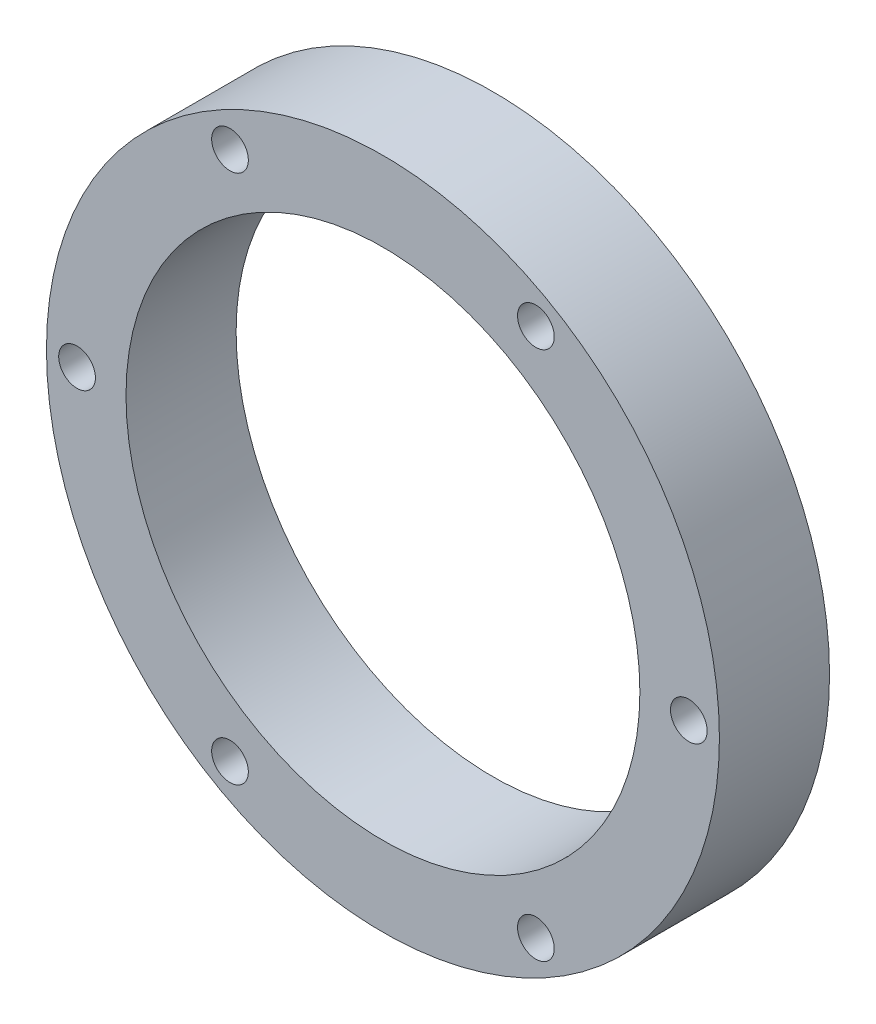
ISO-10303-21;
HEADER;
FILE_DESCRIPTION(('STEP AP214'),'2;1');
FILE_NAME('part.step','',(''),(''),'','','');
FILE_SCHEMA(('AUTOMOTIVE_DESIGN { 1 0 10303 214 1 1 1 1 }'));
ENDSEC;
DATA;
#1=APPLICATION_CONTEXT('core data for automotive mechanical design processes');
#2=APPLICATION_PROTOCOL_DEFINITION('international standard','automotive_design',2000,#1);
#3=PRODUCT_CONTEXT('',#1,'mechanical');
#4=PRODUCT('Part','Part','',(#3));
#5=PRODUCT_RELATED_PRODUCT_CATEGORY('part','',(#4));
#6=PRODUCT_DEFINITION_FORMATION('','',#4);
#7=PRODUCT_DEFINITION_CONTEXT('part definition',#1,'design');
#8=PRODUCT_DEFINITION('design','',#6,#7);
#9=PRODUCT_DEFINITION_SHAPE('','',#8);
#10=(LENGTH_UNIT() NAMED_UNIT(*) SI_UNIT(.MILLI.,.METRE.));
#11=(NAMED_UNIT(*) PLANE_ANGLE_UNIT() SI_UNIT($,.RADIAN.));
#12=(NAMED_UNIT(*) SI_UNIT($,.STERADIAN.) SOLID_ANGLE_UNIT());
#13=UNCERTAINTY_MEASURE_WITH_UNIT(LENGTH_MEASURE(1.E-05),#10,'distance_accuracy_value','');
#14=(GEOMETRIC_REPRESENTATION_CONTEXT(3) GLOBAL_UNCERTAINTY_ASSIGNED_CONTEXT((#13)) GLOBAL_UNIT_ASSIGNED_CONTEXT((#10,
#11,#12)) REPRESENTATION_CONTEXT('',''));
#15=CARTESIAN_POINT('',(0.,0.,0.));
#16=DIRECTION('',(0.,0.,1.));
#17=DIRECTION('',(1.,0.,0.));
#18=AXIS2_PLACEMENT_3D('',#15,#16,#17);
#19=CARTESIAN_POINT('',(0.,0.,9.));
#20=DIRECTION('',(0.,0.,1.));
#21=DIRECTION('',(1.,0.,0.));
#22=AXIS2_PLACEMENT_3D('',#19,#20,#21);
#23=PLANE('',#22);
#24=CARTESIAN_POINT('',(25.,0.,9.));
#25=DIRECTION('',(0.,0.,1.));
#26=DIRECTION('',(1.,0.,0.));
#27=AXIS2_PLACEMENT_3D('',#24,#25,#26);
#28=CIRCLE('',#27,1.5);
#29=CARTESIAN_POINT('',(26.5,0.,9.));
#30=VERTEX_POINT('',#29);
#31=EDGE_CURVE('E72',#30,#30,#28,.T.);
#32=ORIENTED_EDGE('',*,*,#31,.F.);
#33=EDGE_LOOP('',(#32));
#34=FACE_BOUND('',#33,.T.);
#35=CARTESIAN_POINT('',(-12.4999999999999,-21.650635094611,9.));
#36=DIRECTION('',(0.,0.,1.));
#37=DIRECTION('',(1.,0.,0.));
#38=AXIS2_PLACEMENT_3D('',#35,#36,#37);
#39=CIRCLE('',#38,1.5);
#40=CARTESIAN_POINT('',(-10.9999999999999,-21.650635094611,9.));
#41=VERTEX_POINT('',#40);
#42=EDGE_CURVE('E60',#41,#41,#39,.T.);
#43=ORIENTED_EDGE('',*,*,#42,.F.);
#44=EDGE_LOOP('',(#43));
#45=FACE_BOUND('',#44,.T.);
#46=CARTESIAN_POINT('',(-12.5000000000001,21.6506350946109,9.));
#47=DIRECTION('',(0.,0.,1.));
#48=DIRECTION('',(1.,0.,0.));
#49=AXIS2_PLACEMENT_3D('',#46,#47,#48);
#50=CIRCLE('',#49,1.5);
#51=CARTESIAN_POINT('',(-11.0000000000001,21.6506350946109,9.));
#52=VERTEX_POINT('',#51);
#53=EDGE_CURVE('E48',#52,#52,#50,.T.);
#54=ORIENTED_EDGE('',*,*,#53,.F.);
#55=EDGE_LOOP('',(#54));
#56=FACE_BOUND('',#55,.T.);
#57=CARTESIAN_POINT('',(0.,0.,9.));
#58=DIRECTION('',(0.,0.,1.));
#59=DIRECTION('',(1.,0.,0.));
#60=AXIS2_PLACEMENT_3D('',#57,#58,#59);
#61=CIRCLE('',#60,27.5);
#62=CARTESIAN_POINT('',(27.5,0.,9.));
#63=VERTEX_POINT('',#62);
#64=EDGE_CURVE('E10',#63,#63,#61,.T.);
#65=ORIENTED_EDGE('',*,*,#64,.T.);
#66=EDGE_LOOP('',(#65));
#67=FACE_BOUND('',#66,.T.);
#68=CARTESIAN_POINT('',(0.,0.,9.));
#69=DIRECTION('',(0.,0.,1.));
#70=DIRECTION('',(1.,0.,0.));
#71=AXIS2_PLACEMENT_3D('',#68,#69,#70);
#72=CIRCLE('',#71,21.);
#73=CARTESIAN_POINT('',(21.,0.,9.));
#74=VERTEX_POINT('',#73);
#75=EDGE_CURVE('E43',#74,#74,#72,.T.);
#76=ORIENTED_EDGE('',*,*,#75,.F.);
#77=EDGE_LOOP('',(#76));
#78=FACE_BOUND('',#77,.T.);
#79=CARTESIAN_POINT('',(-25.,0.,9.));
#80=DIRECTION('',(0.,0.,1.));
#81=DIRECTION('',(1.,0.,0.));
#82=AXIS2_PLACEMENT_3D('',#79,#80,#81);
#83=CIRCLE('',#82,1.5);
#84=CARTESIAN_POINT('',(-23.5,0.,9.));
#85=VERTEX_POINT('',#84);
#86=EDGE_CURVE('E54',#85,#85,#83,.T.);
#87=ORIENTED_EDGE('',*,*,#86,.F.);
#88=EDGE_LOOP('',(#87));
#89=FACE_BOUND('',#88,.T.);
#90=CARTESIAN_POINT('',(12.5000000000001,-21.6506350946109,9.));
#91=DIRECTION('',(0.,0.,1.));
#92=DIRECTION('',(1.,0.,0.));
#93=AXIS2_PLACEMENT_3D('',#90,#91,#92);
#94=CIRCLE('',#93,1.5);
#95=CARTESIAN_POINT('',(14.0000000000001,-21.6506350946109,9.));
#96=VERTEX_POINT('',#95);
#97=EDGE_CURVE('E66',#96,#96,#94,.T.);
#98=ORIENTED_EDGE('',*,*,#97,.F.);
#99=EDGE_LOOP('',(#98));
#100=FACE_BOUND('',#99,.T.);
#101=CARTESIAN_POINT('',(12.4999999999999,21.650635094611,9.));
#102=DIRECTION('',(0.,0.,1.));
#103=DIRECTION('',(1.,0.,0.));
#104=AXIS2_PLACEMENT_3D('',#101,#102,#103);
#105=CIRCLE('',#104,1.5);
#106=CARTESIAN_POINT('',(13.9999999999999,21.650635094611,9.));
#107=VERTEX_POINT('',#106);
#108=EDGE_CURVE('E78',#107,#107,#105,.T.);
#109=ORIENTED_EDGE('',*,*,#108,.F.);
#110=EDGE_LOOP('',(#109));
#111=FACE_BOUND('',#110,.T.);
#112=ADVANCED_FACE('F32',(#34,#45,#56,#67,#78,#89,#100,#111),#23,.T.);
#113=CARTESIAN_POINT('',(0.,0.,0.));
#114=DIRECTION('',(0.,0.,1.));
#115=DIRECTION('',(1.,0.,0.));
#116=AXIS2_PLACEMENT_3D('',#113,#114,#115);
#117=PLANE('',#116);
#118=CARTESIAN_POINT('',(0.,0.,0.));
#119=DIRECTION('',(0.,0.,1.));
#120=DIRECTION('',(1.,0.,0.));
#121=AXIS2_PLACEMENT_3D('',#118,#119,#120);
#122=CIRCLE('',#121,27.5);
#123=CARTESIAN_POINT('',(27.5,0.,0.));
#124=VERTEX_POINT('',#123);
#125=EDGE_CURVE('E36',#124,#124,#122,.T.);
#126=ORIENTED_EDGE('',*,*,#125,.F.);
#127=EDGE_LOOP('',(#126));
#128=FACE_BOUND('',#127,.T.);
#129=CARTESIAN_POINT('',(0.,0.,0.));
#130=DIRECTION('',(0.,0.,1.));
#131=DIRECTION('',(1.,0.,0.));
#132=AXIS2_PLACEMENT_3D('',#129,#130,#131);
#133=CIRCLE('',#132,21.);
#134=CARTESIAN_POINT('',(21.,0.,0.));
#135=VERTEX_POINT('',#134);
#136=EDGE_CURVE('E45',#135,#135,#133,.T.);
#137=ORIENTED_EDGE('',*,*,#136,.T.);
#138=EDGE_LOOP('',(#137));
#139=FACE_BOUND('',#138,.T.);
#140=CARTESIAN_POINT('',(-12.5000000000001,21.6506350946109,0.));
#141=DIRECTION('',(0.,0.,1.));
#142=DIRECTION('',(1.,0.,0.));
#143=AXIS2_PLACEMENT_3D('',#140,#141,#142);
#144=CIRCLE('',#143,1.5);
#145=CARTESIAN_POINT('',(-11.0000000000001,21.6506350946109,0.));
#146=VERTEX_POINT('',#145);
#147=EDGE_CURVE('E51',#146,#146,#144,.T.);
#148=ORIENTED_EDGE('',*,*,#147,.T.);
#149=EDGE_LOOP('',(#148));
#150=FACE_BOUND('',#149,.T.);
#151=CARTESIAN_POINT('',(-25.,0.,0.));
#152=DIRECTION('',(0.,0.,1.));
#153=DIRECTION('',(1.,0.,0.));
#154=AXIS2_PLACEMENT_3D('',#151,#152,#153);
#155=CIRCLE('',#154,1.5);
#156=CARTESIAN_POINT('',(-23.5,0.,0.));
#157=VERTEX_POINT('',#156);
#158=EDGE_CURVE('E57',#157,#157,#155,.T.);
#159=ORIENTED_EDGE('',*,*,#158,.T.);
#160=EDGE_LOOP('',(#159));
#161=FACE_BOUND('',#160,.T.);
#162=CARTESIAN_POINT('',(-12.4999999999999,-21.650635094611,0.));
#163=DIRECTION('',(0.,0.,1.));
#164=DIRECTION('',(1.,0.,0.));
#165=AXIS2_PLACEMENT_3D('',#162,#163,#164);
#166=CIRCLE('',#165,1.5);
#167=CARTESIAN_POINT('',(-10.9999999999999,-21.650635094611,0.));
#168=VERTEX_POINT('',#167);
#169=EDGE_CURVE('E63',#168,#168,#166,.T.);
#170=ORIENTED_EDGE('',*,*,#169,.T.);
#171=EDGE_LOOP('',(#170));
#172=FACE_BOUND('',#171,.T.);
#173=CARTESIAN_POINT('',(12.5000000000001,-21.6506350946109,0.));
#174=DIRECTION('',(0.,0.,1.));
#175=DIRECTION('',(1.,0.,0.));
#176=AXIS2_PLACEMENT_3D('',#173,#174,#175);
#177=CIRCLE('',#176,1.5);
#178=CARTESIAN_POINT('',(14.0000000000001,-21.6506350946109,0.));
#179=VERTEX_POINT('',#178);
#180=EDGE_CURVE('E69',#179,#179,#177,.T.);
#181=ORIENTED_EDGE('',*,*,#180,.T.);
#182=EDGE_LOOP('',(#181));
#183=FACE_BOUND('',#182,.T.);
#184=CARTESIAN_POINT('',(25.,0.,0.));
#185=DIRECTION('',(0.,0.,1.));
#186=DIRECTION('',(1.,0.,0.));
#187=AXIS2_PLACEMENT_3D('',#184,#185,#186);
#188=CIRCLE('',#187,1.5);
#189=CARTESIAN_POINT('',(26.5,0.,0.));
#190=VERTEX_POINT('',#189);
#191=EDGE_CURVE('E75',#190,#190,#188,.T.);
#192=ORIENTED_EDGE('',*,*,#191,.T.);
#193=EDGE_LOOP('',(#192));
#194=FACE_BOUND('',#193,.T.);
#195=CARTESIAN_POINT('',(12.4999999999999,21.650635094611,0.));
#196=DIRECTION('',(0.,0.,1.));
#197=DIRECTION('',(1.,0.,0.));
#198=AXIS2_PLACEMENT_3D('',#195,#196,#197);
#199=CIRCLE('',#198,1.5);
#200=CARTESIAN_POINT('',(13.9999999999999,21.650635094611,0.));
#201=VERTEX_POINT('',#200);
#202=EDGE_CURVE('E81',#201,#201,#199,.T.);
#203=ORIENTED_EDGE('',*,*,#202,.T.);
#204=EDGE_LOOP('',(#203));
#205=FACE_BOUND('',#204,.T.);
#206=ADVANCED_FACE('F91',(#128,#139,#150,#161,#172,#183,#194,#205),#117,.F.);
#207=CARTESIAN_POINT('',(0.,0.,9.));
#208=DIRECTION('',(0.,0.,-1.));
#209=DIRECTION('',(-1.,0.,0.));
#210=AXIS2_PLACEMENT_3D('',#207,#208,#209);
#211=CYLINDRICAL_SURFACE('',#210,27.5);
#212=ORIENTED_EDGE('',*,*,#64,.F.);
#213=EDGE_LOOP('',(#212));
#214=FACE_BOUND('',#213,.T.);
#215=ORIENTED_EDGE('',*,*,#125,.T.);
#216=EDGE_LOOP('',(#215));
#217=FACE_BOUND('',#216,.T.);
#218=ADVANCED_FACE('F34',(#214,#217),#211,.T.);
#219=CARTESIAN_POINT('',(0.,0.,9.));
#220=DIRECTION('',(0.,0.,-1.));
#221=DIRECTION('',(-1.,0.,0.));
#222=AXIS2_PLACEMENT_3D('',#219,#220,#221);
#223=CYLINDRICAL_SURFACE('',#222,21.);
#224=ORIENTED_EDGE('',*,*,#75,.T.);
#225=EDGE_LOOP('',(#224));
#226=FACE_BOUND('',#225,.T.);
#227=ORIENTED_EDGE('',*,*,#136,.F.);
#228=EDGE_LOOP('',(#227));
#229=FACE_BOUND('',#228,.T.);
#230=ADVANCED_FACE('F101',(#226,#229),#223,.F.);
#231=CARTESIAN_POINT('',(-12.5000000000001,21.6506350946109,9.));
#232=DIRECTION('',(0.,0.,-1.));
#233=DIRECTION('',(-1.,0.,0.));
#234=AXIS2_PLACEMENT_3D('',#231,#232,#233);
#235=CYLINDRICAL_SURFACE('',#234,1.5);
#236=ORIENTED_EDGE('',*,*,#53,.T.);
#237=EDGE_LOOP('',(#236));
#238=FACE_BOUND('',#237,.T.);
#239=ORIENTED_EDGE('',*,*,#147,.F.);
#240=EDGE_LOOP('',(#239));
#241=FACE_BOUND('',#240,.T.);
#242=ADVANCED_FACE('F104',(#238,#241),#235,.F.);
#243=CARTESIAN_POINT('',(-25.,0.,9.));
#244=DIRECTION('',(0.,0.,-1.));
#245=DIRECTION('',(-1.,0.,0.));
#246=AXIS2_PLACEMENT_3D('',#243,#244,#245);
#247=CYLINDRICAL_SURFACE('',#246,1.5);
#248=ORIENTED_EDGE('',*,*,#86,.T.);
#249=EDGE_LOOP('',(#248));
#250=FACE_BOUND('',#249,.T.);
#251=ORIENTED_EDGE('',*,*,#158,.F.);
#252=EDGE_LOOP('',(#251));
#253=FACE_BOUND('',#252,.T.);
#254=ADVANCED_FACE('F108',(#250,#253),#247,.F.);
#255=CARTESIAN_POINT('',(-12.4999999999999,-21.650635094611,9.));
#256=DIRECTION('',(0.,0.,-1.));
#257=DIRECTION('',(-1.,0.,0.));
#258=AXIS2_PLACEMENT_3D('',#255,#256,#257);
#259=CYLINDRICAL_SURFACE('',#258,1.5);
#260=ORIENTED_EDGE('',*,*,#42,.T.);
#261=EDGE_LOOP('',(#260));
#262=FACE_BOUND('',#261,.T.);
#263=ORIENTED_EDGE('',*,*,#169,.F.);
#264=EDGE_LOOP('',(#263));
#265=FACE_BOUND('',#264,.T.);
#266=ADVANCED_FACE('F112',(#262,#265),#259,.F.);
#267=CARTESIAN_POINT('',(12.5000000000001,-21.6506350946109,9.));
#268=DIRECTION('',(0.,0.,-1.));
#269=DIRECTION('',(-1.,0.,0.));
#270=AXIS2_PLACEMENT_3D('',#267,#268,#269);
#271=CYLINDRICAL_SURFACE('',#270,1.5);
#272=ORIENTED_EDGE('',*,*,#97,.T.);
#273=EDGE_LOOP('',(#272));
#274=FACE_BOUND('',#273,.T.);
#275=ORIENTED_EDGE('',*,*,#180,.F.);
#276=EDGE_LOOP('',(#275));
#277=FACE_BOUND('',#276,.T.);
#278=ADVANCED_FACE('F116',(#274,#277),#271,.F.);
#279=CARTESIAN_POINT('',(25.,0.,9.));
#280=DIRECTION('',(0.,0.,-1.));
#281=DIRECTION('',(-1.,0.,0.));
#282=AXIS2_PLACEMENT_3D('',#279,#280,#281);
#283=CYLINDRICAL_SURFACE('',#282,1.5);
#284=ORIENTED_EDGE('',*,*,#31,.T.);
#285=EDGE_LOOP('',(#284));
#286=FACE_BOUND('',#285,.T.);
#287=ORIENTED_EDGE('',*,*,#191,.F.);
#288=EDGE_LOOP('',(#287));
#289=FACE_BOUND('',#288,.T.);
#290=ADVANCED_FACE('F120',(#286,#289),#283,.F.);
#291=CARTESIAN_POINT('',(12.4999999999999,21.650635094611,9.));
#292=DIRECTION('',(0.,0.,-1.));
#293=DIRECTION('',(-1.,0.,0.));
#294=AXIS2_PLACEMENT_3D('',#291,#292,#293);
#295=CYLINDRICAL_SURFACE('',#294,1.5);
#296=ORIENTED_EDGE('',*,*,#108,.T.);
#297=EDGE_LOOP('',(#296));
#298=FACE_BOUND('',#297,.T.);
#299=ORIENTED_EDGE('',*,*,#202,.F.);
#300=EDGE_LOOP('',(#299));
#301=FACE_BOUND('',#300,.T.);
#302=ADVANCED_FACE('F87',(#298,#301),#295,.F.);
#303=CLOSED_SHELL('',(#112,#206,#218,#230,#242,#254,#266,#278,#290,#302));
#304=MANIFOLD_SOLID_BREP('B2',#303);
#305=ADVANCED_BREP_SHAPE_REPRESENTATION('',(#18,#304),#14);
#306=SHAPE_DEFINITION_REPRESENTATION(#9,#305);
ENDSEC;
END-ISO-10303-21;
